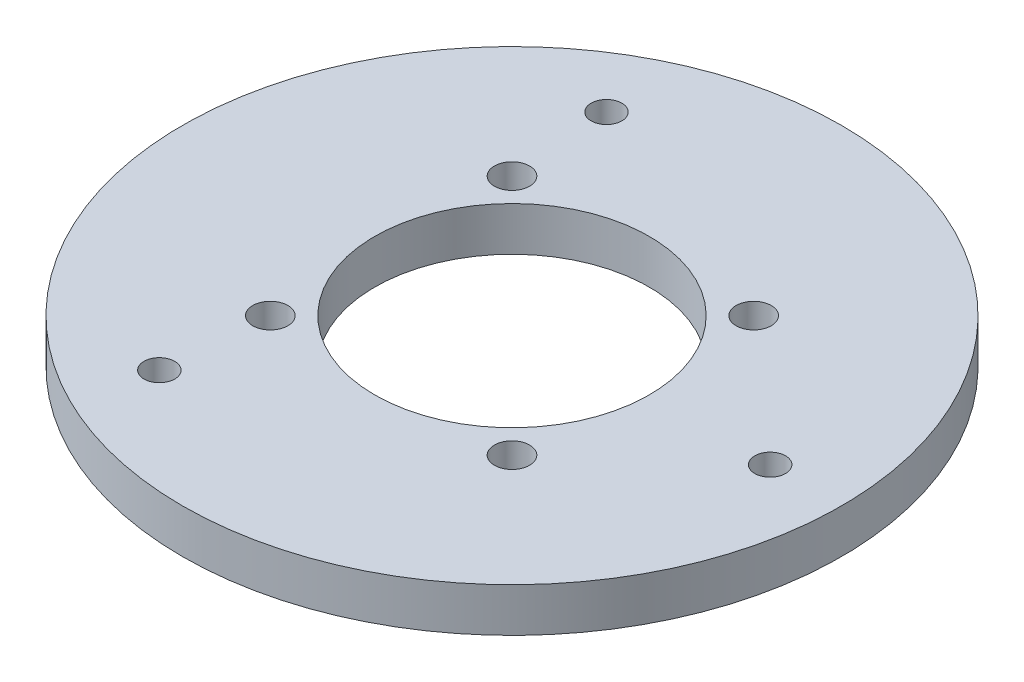
ISO-10303-21;
HEADER;
FILE_DESCRIPTION(('STEP AP214'),'2;1');
FILE_NAME('part.step','',(''),(''),'','','');
FILE_SCHEMA(('AUTOMOTIVE_DESIGN { 1 0 10303 214 1 1 1 1 }'));
ENDSEC;
DATA;
#1=APPLICATION_CONTEXT('core data for automotive mechanical design processes');
#2=APPLICATION_PROTOCOL_DEFINITION('international standard','automotive_design',2000,#1);
#3=PRODUCT_CONTEXT('',#1,'mechanical');
#4=PRODUCT('Part','Part','',(#3));
#5=PRODUCT_RELATED_PRODUCT_CATEGORY('part','',(#4));
#6=PRODUCT_DEFINITION_FORMATION('','',#4);
#7=PRODUCT_DEFINITION_CONTEXT('part definition',#1,'design');
#8=PRODUCT_DEFINITION('design','',#6,#7);
#9=PRODUCT_DEFINITION_SHAPE('','',#8);
#10=(LENGTH_UNIT() NAMED_UNIT(*) SI_UNIT(.MILLI.,.METRE.));
#11=(NAMED_UNIT(*) PLANE_ANGLE_UNIT() SI_UNIT($,.RADIAN.));
#12=(NAMED_UNIT(*) SI_UNIT($,.STERADIAN.) SOLID_ANGLE_UNIT());
#13=UNCERTAINTY_MEASURE_WITH_UNIT(LENGTH_MEASURE(1.E-05),#10,'distance_accuracy_value','');
#14=(GEOMETRIC_REPRESENTATION_CONTEXT(3) GLOBAL_UNCERTAINTY_ASSIGNED_CONTEXT((#13)) GLOBAL_UNIT_ASSIGNED_CONTEXT((#10,
#11,#12)) REPRESENTATION_CONTEXT('',''));
#15=CARTESIAN_POINT('',(0.,0.,0.));
#16=DIRECTION('',(0.,0.,1.));
#17=DIRECTION('',(1.,0.,0.));
#18=AXIS2_PLACEMENT_3D('',#15,#16,#17);
#19=CARTESIAN_POINT('',(0.,4.,0.));
#20=DIRECTION('',(0.,1.,0.));
#21=DIRECTION('',(0.,0.,1.));
#22=AXIS2_PLACEMENT_3D('',#19,#20,#21);
#23=PLANE('',#22);
#24=CARTESIAN_POINT('',(23.5,4.,0.));
#25=DIRECTION('',(0.,1.,0.));
#26=DIRECTION('',(0.,0.,1.));
#27=AXIS2_PLACEMENT_3D('',#24,#25,#26);
#28=CIRCLE('',#27,1.4);
#29=CARTESIAN_POINT('',(23.5,4.,1.4));
#30=VERTEX_POINT('',#29);
#31=EDGE_CURVE('E55',#30,#30,#28,.T.);
#32=ORIENTED_EDGE('',*,*,#31,.F.);
#33=EDGE_LOOP('',(#32));
#34=FACE_BOUND('',#33,.T.);
#35=CARTESIAN_POINT('',(-11.75,4.,-20.3515969889343));
#36=DIRECTION('',(0.,1.,0.));
#37=DIRECTION('',(0.,0.,1.));
#38=AXIS2_PLACEMENT_3D('',#35,#36,#37);
#39=CIRCLE('',#38,1.4);
#40=CARTESIAN_POINT('',(-11.75,4.,-18.9515969889343));
#41=VERTEX_POINT('',#40);
#42=EDGE_CURVE('E111',#41,#41,#39,.T.);
#43=ORIENTED_EDGE('',*,*,#42,.F.);
#44=EDGE_LOOP('',(#43));
#45=FACE_BOUND('',#44,.T.);
#46=CARTESIAN_POINT('',(-11.75,4.,20.3515969889343));
#47=DIRECTION('',(0.,1.,0.));
#48=DIRECTION('',(0.,0.,1.));
#49=AXIS2_PLACEMENT_3D('',#46,#47,#48);
#50=CIRCLE('',#49,1.4);
#51=CARTESIAN_POINT('',(-11.75,4.,21.7515969889343));
#52=VERTEX_POINT('',#51);
#53=EDGE_CURVE('E115',#52,#52,#50,.T.);
#54=ORIENTED_EDGE('',*,*,#53,.F.);
#55=EDGE_LOOP('',(#54));
#56=FACE_BOUND('',#55,.T.);
#57=CARTESIAN_POINT('',(-11.,4.,-11.));
#58=DIRECTION('',(0.,1.,0.));
#59=DIRECTION('',(0.,0.,1.));
#60=AXIS2_PLACEMENT_3D('',#57,#58,#59);
#61=CIRCLE('',#60,1.6);
#62=CARTESIAN_POINT('',(-11.,4.,-9.4));
#63=VERTEX_POINT('',#62);
#64=EDGE_CURVE('E60',#63,#63,#61,.T.);
#65=ORIENTED_EDGE('',*,*,#64,.F.);
#66=EDGE_LOOP('',(#65));
#67=FACE_BOUND('',#66,.T.);
#68=CARTESIAN_POINT('',(-11.,4.,11.));
#69=DIRECTION('',(0.,1.,0.));
#70=DIRECTION('',(0.,0.,1.));
#71=AXIS2_PLACEMENT_3D('',#68,#69,#70);
#72=CIRCLE('',#71,1.6);
#73=CARTESIAN_POINT('',(-11.,4.,12.6));
#74=VERTEX_POINT('',#73);
#75=EDGE_CURVE('E69',#74,#74,#72,.T.);
#76=ORIENTED_EDGE('',*,*,#75,.F.);
#77=EDGE_LOOP('',(#76));
#78=FACE_BOUND('',#77,.T.);
#79=CARTESIAN_POINT('',(11.,4.,11.));
#80=DIRECTION('',(0.,1.,0.));
#81=DIRECTION('',(0.,0.,1.));
#82=AXIS2_PLACEMENT_3D('',#79,#80,#81);
#83=CIRCLE('',#82,1.6);
#84=CARTESIAN_POINT('',(11.,4.,12.6));
#85=VERTEX_POINT('',#84);
#86=EDGE_CURVE('E123',#85,#85,#83,.T.);
#87=ORIENTED_EDGE('',*,*,#86,.F.);
#88=EDGE_LOOP('',(#87));
#89=FACE_BOUND('',#88,.T.);
#90=CARTESIAN_POINT('',(11.,4.,-11.));
#91=DIRECTION('',(0.,1.,0.));
#92=DIRECTION('',(0.,0.,1.));
#93=AXIS2_PLACEMENT_3D('',#90,#91,#92);
#94=CIRCLE('',#93,1.6);
#95=CARTESIAN_POINT('',(11.,4.,-9.4));
#96=VERTEX_POINT('',#95);
#97=EDGE_CURVE('E76',#96,#96,#94,.T.);
#98=ORIENTED_EDGE('',*,*,#97,.F.);
#99=EDGE_LOOP('',(#98));
#100=FACE_BOUND('',#99,.T.);
#101=CARTESIAN_POINT('',(0.,4.,0.));
#102=DIRECTION('',(0.,1.,0.));
#103=DIRECTION('',(0.,0.,1.));
#104=AXIS2_PLACEMENT_3D('',#101,#102,#103);
#105=CIRCLE('',#104,30.);
#106=CARTESIAN_POINT('',(0.,4.,30.));
#107=VERTEX_POINT('',#106);
#108=EDGE_CURVE('E10',#107,#107,#105,.T.);
#109=ORIENTED_EDGE('',*,*,#108,.T.);
#110=EDGE_LOOP('',(#109));
#111=FACE_BOUND('',#110,.T.);
#112=CARTESIAN_POINT('',(0.,4.,0.));
#113=DIRECTION('',(0.,1.,0.));
#114=DIRECTION('',(0.,0.,1.));
#115=AXIS2_PLACEMENT_3D('',#112,#113,#114);
#116=CIRCLE('',#115,12.5);
#117=CARTESIAN_POINT('',(0.,4.,12.5));
#118=VERTEX_POINT('',#117);
#119=EDGE_CURVE('E46',#118,#118,#116,.T.);
#120=ORIENTED_EDGE('',*,*,#119,.F.);
#121=EDGE_LOOP('',(#120));
#122=FACE_BOUND('',#121,.T.);
#123=ADVANCED_FACE('F33',(#34,#45,#56,#67,#78,#89,#100,#111,#122),#23,.T.);
#124=CARTESIAN_POINT('',(0.,0.,0.));
#125=DIRECTION('',(0.,1.,0.));
#126=DIRECTION('',(0.,0.,1.));
#127=AXIS2_PLACEMENT_3D('',#124,#125,#126);
#128=PLANE('',#127);
#129=CARTESIAN_POINT('',(23.5,0.,0.));
#130=DIRECTION('',(0.,1.,0.));
#131=DIRECTION('',(0.,0.,1.));
#132=AXIS2_PLACEMENT_3D('',#129,#130,#131);
#133=CIRCLE('',#132,1.4);
#134=CARTESIAN_POINT('',(23.5,0.,1.4));
#135=VERTEX_POINT('',#134);
#136=EDGE_CURVE('E37',#135,#135,#133,.T.);
#137=ORIENTED_EDGE('',*,*,#136,.T.);
#138=EDGE_LOOP('',(#137));
#139=FACE_BOUND('',#138,.T.);
#140=CARTESIAN_POINT('',(-11.75,0.,-20.3515969889343));
#141=DIRECTION('',(0.,1.,0.));
#142=DIRECTION('',(0.,0.,1.));
#143=AXIS2_PLACEMENT_3D('',#140,#141,#142);
#144=CIRCLE('',#143,1.4);
#145=CARTESIAN_POINT('',(-11.75,0.,-18.9515969889343));
#146=VERTEX_POINT('',#145);
#147=EDGE_CURVE('E54',#146,#146,#144,.T.);
#148=ORIENTED_EDGE('',*,*,#147,.T.);
#149=EDGE_LOOP('',(#148));
#150=FACE_BOUND('',#149,.T.);
#151=CARTESIAN_POINT('',(-11.75,0.,20.3515969889343));
#152=DIRECTION('',(0.,1.,0.));
#153=DIRECTION('',(0.,0.,1.));
#154=AXIS2_PLACEMENT_3D('',#151,#152,#153);
#155=CIRCLE('',#154,1.4);
#156=CARTESIAN_POINT('',(-11.75,0.,21.7515969889343));
#157=VERTEX_POINT('',#156);
#158=EDGE_CURVE('E52',#157,#157,#155,.T.);
#159=ORIENTED_EDGE('',*,*,#158,.T.);
#160=EDGE_LOOP('',(#159));
#161=FACE_BOUND('',#160,.T.);
#162=CARTESIAN_POINT('',(-11.,0.,-11.));
#163=DIRECTION('',(0.,1.,0.));
#164=DIRECTION('',(0.,0.,1.));
#165=AXIS2_PLACEMENT_3D('',#162,#163,#164);
#166=CIRCLE('',#165,1.6);
#167=CARTESIAN_POINT('',(-11.,0.,-9.4));
#168=VERTEX_POINT('',#167);
#169=EDGE_CURVE('E64',#168,#168,#166,.T.);
#170=ORIENTED_EDGE('',*,*,#169,.T.);
#171=EDGE_LOOP('',(#170));
#172=FACE_BOUND('',#171,.T.);
#173=CARTESIAN_POINT('',(-11.,0.,11.));
#174=DIRECTION('',(0.,1.,0.));
#175=DIRECTION('',(0.,0.,1.));
#176=AXIS2_PLACEMENT_3D('',#173,#174,#175);
#177=CIRCLE('',#176,1.6);
#178=CARTESIAN_POINT('',(-11.,0.,12.6));
#179=VERTEX_POINT('',#178);
#180=EDGE_CURVE('E128',#179,#179,#177,.T.);
#181=ORIENTED_EDGE('',*,*,#180,.T.);
#182=EDGE_LOOP('',(#181));
#183=FACE_BOUND('',#182,.T.);
#184=CARTESIAN_POINT('',(11.,0.,11.));
#185=DIRECTION('',(0.,1.,0.));
#186=DIRECTION('',(0.,0.,1.));
#187=AXIS2_PLACEMENT_3D('',#184,#185,#186);
#188=CIRCLE('',#187,1.6);
#189=CARTESIAN_POINT('',(11.,0.,12.6));
#190=VERTEX_POINT('',#189);
#191=EDGE_CURVE('E78',#190,#190,#188,.T.);
#192=ORIENTED_EDGE('',*,*,#191,.T.);
#193=EDGE_LOOP('',(#192));
#194=FACE_BOUND('',#193,.T.);
#195=CARTESIAN_POINT('',(11.,0.,-11.));
#196=DIRECTION('',(0.,1.,0.));
#197=DIRECTION('',(0.,0.,1.));
#198=AXIS2_PLACEMENT_3D('',#195,#196,#197);
#199=CIRCLE('',#198,1.6);
#200=CARTESIAN_POINT('',(11.,0.,-9.4));
#201=VERTEX_POINT('',#200);
#202=EDGE_CURVE('E73',#201,#201,#199,.T.);
#203=ORIENTED_EDGE('',*,*,#202,.T.);
#204=EDGE_LOOP('',(#203));
#205=FACE_BOUND('',#204,.T.);
#206=CARTESIAN_POINT('',(0.,0.,0.));
#207=DIRECTION('',(0.,1.,0.));
#208=DIRECTION('',(0.,0.,1.));
#209=AXIS2_PLACEMENT_3D('',#206,#207,#208);
#210=CIRCLE('',#209,30.);
#211=CARTESIAN_POINT('',(0.,0.,30.));
#212=VERTEX_POINT('',#211);
#213=EDGE_CURVE('E41',#212,#212,#210,.T.);
#214=ORIENTED_EDGE('',*,*,#213,.F.);
#215=EDGE_LOOP('',(#214));
#216=FACE_BOUND('',#215,.T.);
#217=CARTESIAN_POINT('',(0.,0.,0.));
#218=DIRECTION('',(0.,1.,0.));
#219=DIRECTION('',(0.,0.,1.));
#220=AXIS2_PLACEMENT_3D('',#217,#218,#219);
#221=CIRCLE('',#220,12.5);
#222=CARTESIAN_POINT('',(0.,0.,12.5));
#223=VERTEX_POINT('',#222);
#224=EDGE_CURVE('E49',#223,#223,#221,.T.);
#225=ORIENTED_EDGE('',*,*,#224,.T.);
#226=EDGE_LOOP('',(#225));
#227=FACE_BOUND('',#226,.T.);
#228=ADVANCED_FACE('F85',(#139,#150,#161,#172,#183,#194,#205,#216,#227),#128,.F.);
#229=CARTESIAN_POINT('',(0.,4.,0.));
#230=DIRECTION('',(0.,-1.,0.));
#231=DIRECTION('',(0.,0.,-1.));
#232=AXIS2_PLACEMENT_3D('',#229,#230,#231);
#233=CYLINDRICAL_SURFACE('',#232,30.);
#234=ORIENTED_EDGE('',*,*,#108,.F.);
#235=EDGE_LOOP('',(#234));
#236=FACE_BOUND('',#235,.T.);
#237=ORIENTED_EDGE('',*,*,#213,.T.);
#238=EDGE_LOOP('',(#237));
#239=FACE_BOUND('',#238,.T.);
#240=ADVANCED_FACE('F35',(#236,#239),#233,.T.);
#241=CARTESIAN_POINT('',(0.,4.,0.));
#242=DIRECTION('',(0.,-1.,0.));
#243=DIRECTION('',(0.,0.,-1.));
#244=AXIS2_PLACEMENT_3D('',#241,#242,#243);
#245=CYLINDRICAL_SURFACE('',#244,12.5);
#246=ORIENTED_EDGE('',*,*,#119,.T.);
#247=EDGE_LOOP('',(#246));
#248=FACE_BOUND('',#247,.T.);
#249=ORIENTED_EDGE('',*,*,#224,.F.);
#250=EDGE_LOOP('',(#249));
#251=FACE_BOUND('',#250,.T.);
#252=ADVANCED_FACE('F87',(#248,#251),#245,.F.);
#253=CARTESIAN_POINT('',(11.,0.,-11.));
#254=DIRECTION('',(0.,1.,0.));
#255=DIRECTION('',(0.,0.,1.));
#256=AXIS2_PLACEMENT_3D('',#253,#254,#255);
#257=CYLINDRICAL_SURFACE('',#256,1.6);
#258=ORIENTED_EDGE('',*,*,#202,.F.);
#259=EDGE_LOOP('',(#258));
#260=FACE_BOUND('',#259,.T.);
#261=ORIENTED_EDGE('',*,*,#97,.T.);
#262=EDGE_LOOP('',(#261));
#263=FACE_BOUND('',#262,.T.);
#264=ADVANCED_FACE('F89',(#260,#263),#257,.F.);
#265=CARTESIAN_POINT('',(11.,0.,11.));
#266=DIRECTION('',(0.,1.,0.));
#267=DIRECTION('',(0.,0.,1.));
#268=AXIS2_PLACEMENT_3D('',#265,#266,#267);
#269=CYLINDRICAL_SURFACE('',#268,1.6);
#270=ORIENTED_EDGE('',*,*,#191,.F.);
#271=EDGE_LOOP('',(#270));
#272=FACE_BOUND('',#271,.T.);
#273=ORIENTED_EDGE('',*,*,#86,.T.);
#274=EDGE_LOOP('',(#273));
#275=FACE_BOUND('',#274,.T.);
#276=ADVANCED_FACE('F95',(#272,#275),#269,.F.);
#277=CARTESIAN_POINT('',(-11.,0.,11.));
#278=DIRECTION('',(0.,1.,0.));
#279=DIRECTION('',(0.,0.,1.));
#280=AXIS2_PLACEMENT_3D('',#277,#278,#279);
#281=CYLINDRICAL_SURFACE('',#280,1.6);
#282=ORIENTED_EDGE('',*,*,#180,.F.);
#283=EDGE_LOOP('',(#282));
#284=FACE_BOUND('',#283,.T.);
#285=ORIENTED_EDGE('',*,*,#75,.T.);
#286=EDGE_LOOP('',(#285));
#287=FACE_BOUND('',#286,.T.);
#288=ADVANCED_FACE('F136',(#284,#287),#281,.F.);
#289=CARTESIAN_POINT('',(-11.,0.,-11.));
#290=DIRECTION('',(0.,1.,0.));
#291=DIRECTION('',(0.,0.,1.));
#292=AXIS2_PLACEMENT_3D('',#289,#290,#291);
#293=CYLINDRICAL_SURFACE('',#292,1.6);
#294=ORIENTED_EDGE('',*,*,#169,.F.);
#295=EDGE_LOOP('',(#294));
#296=FACE_BOUND('',#295,.T.);
#297=ORIENTED_EDGE('',*,*,#64,.T.);
#298=EDGE_LOOP('',(#297));
#299=FACE_BOUND('',#298,.T.);
#300=ADVANCED_FACE('F138',(#296,#299),#293,.F.);
#301=CARTESIAN_POINT('',(-11.75,-6.,20.3515969889343));
#302=DIRECTION('',(0.,1.,0.));
#303=DIRECTION('',(0.,0.,1.));
#304=AXIS2_PLACEMENT_3D('',#301,#302,#303);
#305=CYLINDRICAL_SURFACE('',#304,1.4);
#306=ORIENTED_EDGE('',*,*,#53,.T.);
#307=EDGE_LOOP('',(#306));
#308=FACE_BOUND('',#307,.T.);
#309=ORIENTED_EDGE('',*,*,#158,.F.);
#310=EDGE_LOOP('',(#309));
#311=FACE_BOUND('',#310,.T.);
#312=ADVANCED_FACE('F145',(#308,#311),#305,.F.);
#313=CARTESIAN_POINT('',(-11.75,-6.,-20.3515969889343));
#314=DIRECTION('',(0.,1.,0.));
#315=DIRECTION('',(0.,0.,1.));
#316=AXIS2_PLACEMENT_3D('',#313,#314,#315);
#317=CYLINDRICAL_SURFACE('',#316,1.4);
#318=ORIENTED_EDGE('',*,*,#42,.T.);
#319=EDGE_LOOP('',(#318));
#320=FACE_BOUND('',#319,.T.);
#321=ORIENTED_EDGE('',*,*,#147,.F.);
#322=EDGE_LOOP('',(#321));
#323=FACE_BOUND('',#322,.T.);
#324=ADVANCED_FACE('F154',(#320,#323),#317,.F.);
#325=CARTESIAN_POINT('',(23.5,-6.,0.));
#326=DIRECTION('',(0.,1.,0.));
#327=DIRECTION('',(0.,0.,1.));
#328=AXIS2_PLACEMENT_3D('',#325,#326,#327);
#329=CYLINDRICAL_SURFACE('',#328,1.4);
#330=ORIENTED_EDGE('',*,*,#31,.T.);
#331=EDGE_LOOP('',(#330));
#332=FACE_BOUND('',#331,.T.);
#333=ORIENTED_EDGE('',*,*,#136,.F.);
#334=EDGE_LOOP('',(#333));
#335=FACE_BOUND('',#334,.T.);
#336=ADVANCED_FACE('F158',(#332,#335),#329,.F.);
#337=CLOSED_SHELL('',(#123,#228,#240,#252,#264,#276,#288,#300,#312,#324,#336));
#338=MANIFOLD_SOLID_BREP('B2',#337);
#339=ADVANCED_BREP_SHAPE_REPRESENTATION('',(#18,#338),#14);
#340=SHAPE_DEFINITION_REPRESENTATION(#9,#339);
ENDSEC;
END-ISO-10303-21;
